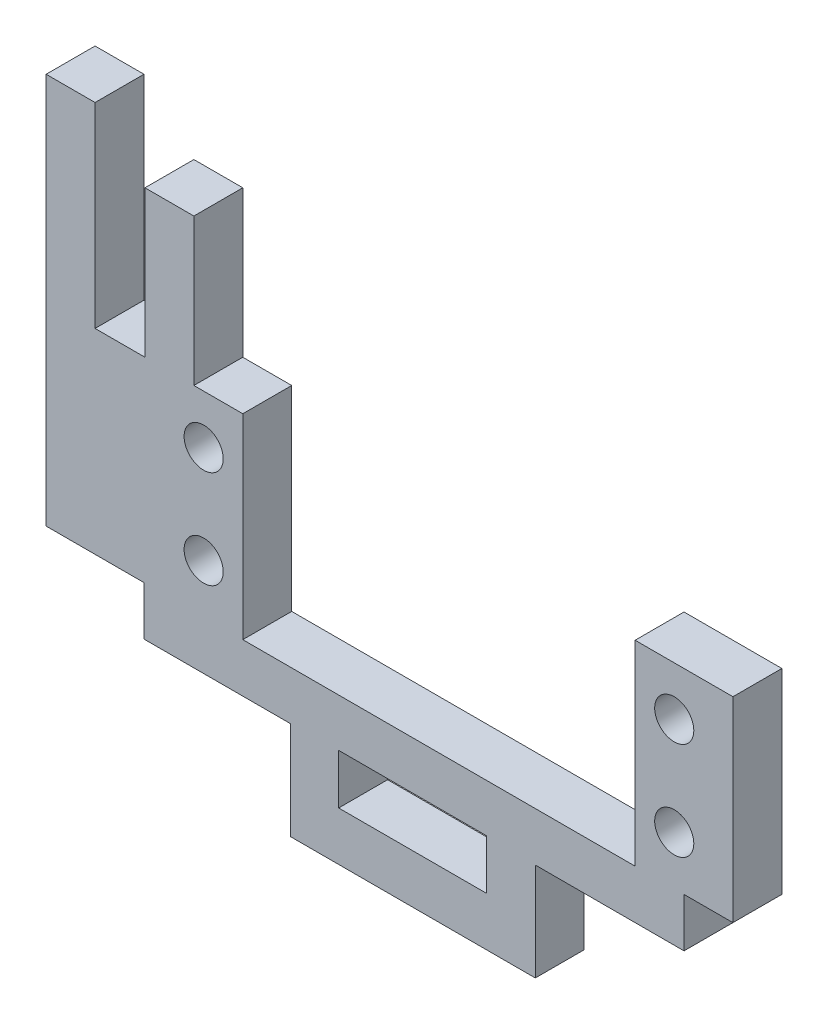
ISO-10303-21;
HEADER;
FILE_DESCRIPTION(('STEP AP214'),'2;1');
FILE_NAME('part.step','',(''),(''),'','','');
FILE_SCHEMA(('AUTOMOTIVE_DESIGN { 1 0 10303 214 1 1 1 1 }'));
ENDSEC;
DATA;
#1=APPLICATION_CONTEXT('core data for automotive mechanical design processes');
#2=APPLICATION_PROTOCOL_DEFINITION('international standard','automotive_design',2000,#1);
#3=PRODUCT_CONTEXT('',#1,'mechanical');
#4=PRODUCT('Part','Part','',(#3));
#5=PRODUCT_RELATED_PRODUCT_CATEGORY('part','',(#4));
#6=PRODUCT_DEFINITION_FORMATION('','',#4);
#7=PRODUCT_DEFINITION_CONTEXT('part definition',#1,'design');
#8=PRODUCT_DEFINITION('design','',#6,#7);
#9=PRODUCT_DEFINITION_SHAPE('','',#8);
#10=(LENGTH_UNIT() NAMED_UNIT(*) SI_UNIT(.MILLI.,.METRE.));
#11=(NAMED_UNIT(*) PLANE_ANGLE_UNIT() SI_UNIT($,.RADIAN.));
#12=(NAMED_UNIT(*) SI_UNIT($,.STERADIAN.) SOLID_ANGLE_UNIT());
#13=UNCERTAINTY_MEASURE_WITH_UNIT(LENGTH_MEASURE(1.E-05),#10,'distance_accuracy_value','');
#14=(GEOMETRIC_REPRESENTATION_CONTEXT(3) GLOBAL_UNCERTAINTY_ASSIGNED_CONTEXT((#13)) GLOBAL_UNIT_ASSIGNED_CONTEXT((#10,
#11,#12)) REPRESENTATION_CONTEXT('',''));
#15=CARTESIAN_POINT('',(0.,0.,0.));
#16=DIRECTION('',(0.,0.,1.));
#17=DIRECTION('',(1.,0.,0.));
#18=AXIS2_PLACEMENT_3D('',#15,#16,#17);
#19=CARTESIAN_POINT('',(0.,0.,5.));
#20=DIRECTION('',(0.,0.,-1.));
#21=DIRECTION('',(-1.,0.,0.));
#22=AXIS2_PLACEMENT_3D('',#19,#20,#21);
#23=PLANE('',#22);
#24=DIRECTION('',(0.,-1.,0.));
#25=VECTOR('',#24,1.);
#26=CARTESIAN_POINT('',(-70.2,-20.,5.));
#27=LINE('',#26,#25);
#28=CARTESIAN_POINT('',(-70.2,20.,5.));
#29=VERTEX_POINT('',#28);
#30=CARTESIAN_POINT('',(-70.2,-20.,5.));
#31=VERTEX_POINT('',#30);
#32=EDGE_CURVE('E257',#29,#31,#27,.T.);
#33=ORIENTED_EDGE('',*,*,#32,.T.);
#34=DIRECTION('',(1.,0.,0.));
#35=VECTOR('',#34,1.);
#36=CARTESIAN_POINT('',(-70.2,-20.,5.));
#37=LINE('',#36,#35);
#38=CARTESIAN_POINT('',(-60.2,-20.,5.));
#39=VERTEX_POINT('',#38);
#40=EDGE_CURVE('E260',#31,#39,#37,.T.);
#41=ORIENTED_EDGE('',*,*,#40,.T.);
#42=DIRECTION('',(0.,-1.,0.));
#43=VECTOR('',#42,1.);
#44=CARTESIAN_POINT('',(-60.2,-20.,5.));
#45=LINE('',#44,#43);
#46=CARTESIAN_POINT('',(-60.2,-25.,5.));
#47=VERTEX_POINT('',#46);
#48=EDGE_CURVE('E263',#39,#47,#45,.T.);
#49=ORIENTED_EDGE('',*,*,#48,.T.);
#50=DIRECTION('',(1.,0.,0.));
#51=VECTOR('',#50,1.);
#52=CARTESIAN_POINT('',(-45.2,-25.,5.));
#53=LINE('',#52,#51);
#54=CARTESIAN_POINT('',(-45.2,-25.,5.));
#55=VERTEX_POINT('',#54);
#56=EDGE_CURVE('E265',#47,#55,#53,.T.);
#57=ORIENTED_EDGE('',*,*,#56,.T.);
#58=DIRECTION('',(0.,-1.,0.));
#59=VECTOR('',#58,1.);
#60=CARTESIAN_POINT('',(-45.2,-35.,5.));
#61=LINE('',#60,#59);
#62=CARTESIAN_POINT('',(-45.2,-35.,5.));
#63=VERTEX_POINT('',#62);
#64=EDGE_CURVE('E267',#55,#63,#61,.T.);
#65=ORIENTED_EDGE('',*,*,#64,.T.);
#66=DIRECTION('',(1.,0.,0.));
#67=VECTOR('',#66,1.);
#68=CARTESIAN_POINT('',(-20.2,-35.,5.));
#69=LINE('',#68,#67);
#70=CARTESIAN_POINT('',(-20.2,-35.,5.));
#71=VERTEX_POINT('',#70);
#72=EDGE_CURVE('E269',#63,#71,#69,.T.);
#73=ORIENTED_EDGE('',*,*,#72,.T.);
#74=DIRECTION('',(0.,1.,0.));
#75=VECTOR('',#74,1.);
#76=CARTESIAN_POINT('',(-20.2,-25.,5.));
#77=LINE('',#76,#75);
#78=CARTESIAN_POINT('',(-20.2,-25.,5.));
#79=VERTEX_POINT('',#78);
#80=EDGE_CURVE('E271',#71,#79,#77,.T.);
#81=ORIENTED_EDGE('',*,*,#80,.T.);
#82=DIRECTION('',(1.,0.,0.));
#83=VECTOR('',#82,1.);
#84=CARTESIAN_POINT('',(-5.,-25.,5.));
#85=LINE('',#84,#83);
#86=CARTESIAN_POINT('',(-5.,-25.,5.));
#87=VERTEX_POINT('',#86);
#88=EDGE_CURVE('E273',#79,#87,#85,.T.);
#89=ORIENTED_EDGE('',*,*,#88,.T.);
#90=DIRECTION('',(0.,1.,0.));
#91=VECTOR('',#90,1.);
#92=CARTESIAN_POINT('',(-5.,-20.,5.));
#93=LINE('',#92,#91);
#94=CARTESIAN_POINT('',(-5.,-20.,5.));
#95=VERTEX_POINT('',#94);
#96=EDGE_CURVE('E275',#87,#95,#93,.T.);
#97=ORIENTED_EDGE('',*,*,#96,.T.);
#98=DIRECTION('',(1.,0.,0.));
#99=VECTOR('',#98,1.);
#100=CARTESIAN_POINT('',(0.,-20.,5.));
#101=LINE('',#100,#99);
#102=CARTESIAN_POINT('',(0.,-20.,5.));
#103=VERTEX_POINT('',#102);
#104=EDGE_CURVE('E277',#95,#103,#101,.T.);
#105=ORIENTED_EDGE('',*,*,#104,.T.);
#106=DIRECTION('',(0.,1.,0.));
#107=VECTOR('',#106,1.);
#108=CARTESIAN_POINT('',(0.,0.,5.));
#109=LINE('',#108,#107);
#110=CARTESIAN_POINT('',(0.,0.,5.));
#111=VERTEX_POINT('',#110);
#112=EDGE_CURVE('E279',#103,#111,#109,.T.);
#113=ORIENTED_EDGE('',*,*,#112,.T.);
#114=DIRECTION('',(-1.,0.,0.));
#115=VECTOR('',#114,1.);
#116=CARTESIAN_POINT('',(-10.,0.,5.));
#117=LINE('',#116,#115);
#118=CARTESIAN_POINT('',(-10.,0.,5.));
#119=VERTEX_POINT('',#118);
#120=EDGE_CURVE('E281',#111,#119,#117,.T.);
#121=ORIENTED_EDGE('',*,*,#120,.T.);
#122=DIRECTION('',(0.,-1.,0.));
#123=VECTOR('',#122,1.);
#124=CARTESIAN_POINT('',(-10.,-20.,5.));
#125=LINE('',#124,#123);
#126=CARTESIAN_POINT('',(-10.,-20.,5.));
#127=VERTEX_POINT('',#126);
#128=EDGE_CURVE('E283',#119,#127,#125,.T.);
#129=ORIENTED_EDGE('',*,*,#128,.T.);
#130=DIRECTION('',(-1.,0.,0.));
#131=VECTOR('',#130,1.);
#132=CARTESIAN_POINT('',(-50.1,-20.,5.));
#133=LINE('',#132,#131);
#134=CARTESIAN_POINT('',(-50.1,-20.,5.));
#135=VERTEX_POINT('',#134);
#136=EDGE_CURVE('E285',#127,#135,#133,.T.);
#137=ORIENTED_EDGE('',*,*,#136,.T.);
#138=DIRECTION('',(0.,1.,0.));
#139=VECTOR('',#138,1.);
#140=CARTESIAN_POINT('',(-50.1,0.,5.));
#141=LINE('',#140,#139);
#142=CARTESIAN_POINT('',(-50.1,0.,5.));
#143=VERTEX_POINT('',#142);
#144=EDGE_CURVE('E287',#135,#143,#141,.T.);
#145=ORIENTED_EDGE('',*,*,#144,.T.);
#146=DIRECTION('',(-1.,0.,0.));
#147=VECTOR('',#146,1.);
#148=CARTESIAN_POINT('',(-55.1,0.,5.));
#149=LINE('',#148,#147);
#150=CARTESIAN_POINT('',(-55.1,0.,5.));
#151=VERTEX_POINT('',#150);
#152=EDGE_CURVE('E289',#143,#151,#149,.T.);
#153=ORIENTED_EDGE('',*,*,#152,.T.);
#154=DIRECTION('',(0.,1.,0.));
#155=VECTOR('',#154,1.);
#156=CARTESIAN_POINT('',(-55.1,15.,5.));
#157=LINE('',#156,#155);
#158=CARTESIAN_POINT('',(-55.1,15.,5.));
#159=VERTEX_POINT('',#158);
#160=EDGE_CURVE('E291',#151,#159,#157,.T.);
#161=ORIENTED_EDGE('',*,*,#160,.T.);
#162=DIRECTION('',(-1.,0.,0.));
#163=VECTOR('',#162,1.);
#164=CARTESIAN_POINT('',(-60.1,15.,5.));
#165=LINE('',#164,#163);
#166=CARTESIAN_POINT('',(-60.1,15.,5.));
#167=VERTEX_POINT('',#166);
#168=EDGE_CURVE('E293',#159,#167,#165,.T.);
#169=ORIENTED_EDGE('',*,*,#168,.T.);
#170=DIRECTION('',(0.,-1.,0.));
#171=VECTOR('',#170,1.);
#172=CARTESIAN_POINT('',(-60.1,0.,5.));
#173=LINE('',#172,#171);
#174=CARTESIAN_POINT('',(-60.1,0.,5.));
#175=VERTEX_POINT('',#174);
#176=EDGE_CURVE('E295',#167,#175,#173,.T.);
#177=ORIENTED_EDGE('',*,*,#176,.T.);
#178=DIRECTION('',(-1.,0.,0.));
#179=VECTOR('',#178,1.);
#180=CARTESIAN_POINT('',(-65.2,0.,5.));
#181=LINE('',#180,#179);
#182=CARTESIAN_POINT('',(-65.2,0.,5.));
#183=VERTEX_POINT('',#182);
#184=EDGE_CURVE('E297',#175,#183,#181,.T.);
#185=ORIENTED_EDGE('',*,*,#184,.T.);
#186=DIRECTION('',(0.,1.,0.));
#187=VECTOR('',#186,1.);
#188=CARTESIAN_POINT('',(-65.2,20.,5.));
#189=LINE('',#188,#187);
#190=CARTESIAN_POINT('',(-65.2,20.,5.));
#191=VERTEX_POINT('',#190);
#192=EDGE_CURVE('E299',#183,#191,#189,.T.);
#193=ORIENTED_EDGE('',*,*,#192,.T.);
#194=DIRECTION('',(-1.,0.,0.));
#195=VECTOR('',#194,1.);
#196=CARTESIAN_POINT('',(-70.2,20.,5.));
#197=LINE('',#196,#195);
#198=EDGE_CURVE('E301',#191,#29,#197,.T.);
#199=ORIENTED_EDGE('',*,*,#198,.T.);
#200=EDGE_LOOP('',(#33,#41,#49,#57,#65,#73,#81,#89,#97,#105,#113,#121,#129,#137,#145,#153,#161,
#169,#177,#185,#193,#199));
#201=FACE_BOUND('',#200,.T.);
#202=DIRECTION('',(0.,1.,0.));
#203=VECTOR('',#202,1.);
#204=CARTESIAN_POINT('',(-25.2,-24.9,5.));
#205=LINE('',#204,#203);
#206=CARTESIAN_POINT('',(-25.2,-30.,5.));
#207=VERTEX_POINT('',#206);
#208=CARTESIAN_POINT('',(-25.2,-24.9,5.));
#209=VERTEX_POINT('',#208);
#210=EDGE_CURVE('E218',#207,#209,#205,.T.);
#211=ORIENTED_EDGE('',*,*,#210,.F.);
#212=DIRECTION('',(1.,0.,0.));
#213=VECTOR('',#212,1.);
#214=CARTESIAN_POINT('',(-40.3,-30.,5.));
#215=LINE('',#214,#213);
#216=CARTESIAN_POINT('',(-40.3,-30.,5.));
#217=VERTEX_POINT('',#216);
#218=EDGE_CURVE('E241',#217,#207,#215,.T.);
#219=ORIENTED_EDGE('',*,*,#218,.F.);
#220=DIRECTION('',(0.,-1.,0.));
#221=VECTOR('',#220,1.);
#222=CARTESIAN_POINT('',(-40.3,-24.9,5.));
#223=LINE('',#222,#221);
#224=CARTESIAN_POINT('',(-40.3,-24.9,5.));
#225=VERTEX_POINT('',#224);
#226=EDGE_CURVE('E239',#225,#217,#223,.T.);
#227=ORIENTED_EDGE('',*,*,#226,.F.);
#228=DIRECTION('',(-1.,0.,0.));
#229=VECTOR('',#228,1.);
#230=CARTESIAN_POINT('',(-40.3,-24.9,5.));
#231=LINE('',#230,#229);
#232=EDGE_CURVE('E226',#209,#225,#231,.T.);
#233=ORIENTED_EDGE('',*,*,#232,.F.);
#234=EDGE_LOOP('',(#211,#219,#227,#233));
#235=FACE_BOUND('',#234,.T.);
#236=CARTESIAN_POINT('',(-54.1,-5.00000000000001,5.));
#237=DIRECTION('',(0.,0.,1.));
#238=DIRECTION('',(1.,0.,0.));
#239=AXIS2_PLACEMENT_3D('',#236,#237,#238);
#240=CIRCLE('',#239,2.);
#241=CARTESIAN_POINT('',(-52.1,-5.00000000000001,5.));
#242=VERTEX_POINT('',#241);
#243=EDGE_CURVE('E247',#242,#242,#240,.T.);
#244=ORIENTED_EDGE('',*,*,#243,.F.);
#245=EDGE_LOOP('',(#244));
#246=FACE_BOUND('',#245,.T.);
#247=CARTESIAN_POINT('',(-54.1,-15.,5.));
#248=DIRECTION('',(0.,0.,1.));
#249=DIRECTION('',(1.,0.,0.));
#250=AXIS2_PLACEMENT_3D('',#247,#248,#249);
#251=CIRCLE('',#250,2.);
#252=CARTESIAN_POINT('',(-52.1,-15.,5.));
#253=VERTEX_POINT('',#252);
#254=EDGE_CURVE('E801',#253,#253,#251,.T.);
#255=ORIENTED_EDGE('',*,*,#254,.F.);
#256=EDGE_LOOP('',(#255));
#257=FACE_BOUND('',#256,.T.);
#258=CARTESIAN_POINT('',(-6.,-5.00000000000001,5.));
#259=DIRECTION('',(0.,0.,1.));
#260=DIRECTION('',(1.,0.,0.));
#261=AXIS2_PLACEMENT_3D('',#258,#259,#260);
#262=CIRCLE('',#261,2.);
#263=CARTESIAN_POINT('',(-4.,-5.00000000000001,5.));
#264=VERTEX_POINT('',#263);
#265=EDGE_CURVE('E795',#264,#264,#262,.T.);
#266=ORIENTED_EDGE('',*,*,#265,.F.);
#267=EDGE_LOOP('',(#266));
#268=FACE_BOUND('',#267,.T.);
#269=CARTESIAN_POINT('',(-6.,-15.,5.));
#270=DIRECTION('',(0.,0.,1.));
#271=DIRECTION('',(1.,0.,0.));
#272=AXIS2_PLACEMENT_3D('',#269,#270,#271);
#273=CIRCLE('',#272,2.);
#274=CARTESIAN_POINT('',(-4.,-15.,5.));
#275=VERTEX_POINT('',#274);
#276=EDGE_CURVE('E786',#275,#275,#273,.T.);
#277=ORIENTED_EDGE('',*,*,#276,.F.);
#278=EDGE_LOOP('',(#277));
#279=FACE_BOUND('',#278,.T.);
#280=ADVANCED_FACE('F45',(#201,#235,#246,#257,#268,#279),#23,.F.);
#281=CARTESIAN_POINT('',(0.,0.,0.));
#282=DIRECTION('',(0.,0.,-1.));
#283=DIRECTION('',(-1.,0.,0.));
#284=AXIS2_PLACEMENT_3D('',#281,#282,#283);
#285=PLANE('',#284);
#286=CARTESIAN_POINT('',(-6.,-5.00000000000001,0.));
#287=DIRECTION('',(0.,0.,1.));
#288=DIRECTION('',(1.,0.,0.));
#289=AXIS2_PLACEMENT_3D('',#286,#287,#288);
#290=CIRCLE('',#289,2.);
#291=CARTESIAN_POINT('',(-4.,-5.00000000000001,0.));
#292=VERTEX_POINT('',#291);
#293=EDGE_CURVE('E792',#292,#292,#290,.T.);
#294=ORIENTED_EDGE('',*,*,#293,.T.);
#295=EDGE_LOOP('',(#294));
#296=FACE_BOUND('',#295,.T.);
#297=CARTESIAN_POINT('',(-54.1,-5.00000000000001,0.));
#298=DIRECTION('',(0.,0.,1.));
#299=DIRECTION('',(1.,0.,0.));
#300=AXIS2_PLACEMENT_3D('',#297,#298,#299);
#301=CIRCLE('',#300,2.);
#302=CARTESIAN_POINT('',(-52.1,-5.00000000000001,0.));
#303=VERTEX_POINT('',#302);
#304=EDGE_CURVE('E804',#303,#303,#301,.T.);
#305=ORIENTED_EDGE('',*,*,#304,.T.);
#306=EDGE_LOOP('',(#305));
#307=FACE_BOUND('',#306,.T.);
#308=DIRECTION('',(0.,-1.,0.));
#309=VECTOR('',#308,1.);
#310=CARTESIAN_POINT('',(-70.2,-20.,0.));
#311=LINE('',#310,#309);
#312=CARTESIAN_POINT('',(-70.2,20.,0.));
#313=VERTEX_POINT('',#312);
#314=CARTESIAN_POINT('',(-70.2,-20.,0.));
#315=VERTEX_POINT('',#314);
#316=EDGE_CURVE('E234',#313,#315,#311,.T.);
#317=ORIENTED_EDGE('',*,*,#316,.F.);
#318=DIRECTION('',(-1.,0.,0.));
#319=VECTOR('',#318,1.);
#320=CARTESIAN_POINT('',(-70.2,20.,0.));
#321=LINE('',#320,#319);
#322=CARTESIAN_POINT('',(-65.2,20.,0.));
#323=VERTEX_POINT('',#322);
#324=EDGE_CURVE('E261',#323,#313,#321,.T.);
#325=ORIENTED_EDGE('',*,*,#324,.F.);
#326=DIRECTION('',(0.,1.,0.));
#327=VECTOR('',#326,1.);
#328=CARTESIAN_POINT('',(-65.2,20.,0.));
#329=LINE('',#328,#327);
#330=CARTESIAN_POINT('',(-65.2,0.,0.));
#331=VERTEX_POINT('',#330);
#332=EDGE_CURVE('E344',#331,#323,#329,.T.);
#333=ORIENTED_EDGE('',*,*,#332,.F.);
#334=DIRECTION('',(-1.,0.,0.));
#335=VECTOR('',#334,1.);
#336=CARTESIAN_POINT('',(-65.2,0.,0.));
#337=LINE('',#336,#335);
#338=CARTESIAN_POINT('',(-60.1,0.,0.));
#339=VERTEX_POINT('',#338);
#340=EDGE_CURVE('E342',#339,#331,#337,.T.);
#341=ORIENTED_EDGE('',*,*,#340,.F.);
#342=DIRECTION('',(0.,-1.,0.));
#343=VECTOR('',#342,1.);
#344=CARTESIAN_POINT('',(-60.1,0.,0.));
#345=LINE('',#344,#343);
#346=CARTESIAN_POINT('',(-60.1,15.,0.));
#347=VERTEX_POINT('',#346);
#348=EDGE_CURVE('E340',#347,#339,#345,.T.);
#349=ORIENTED_EDGE('',*,*,#348,.F.);
#350=DIRECTION('',(-1.,0.,0.));
#351=VECTOR('',#350,1.);
#352=CARTESIAN_POINT('',(-60.1,15.,0.));
#353=LINE('',#352,#351);
#354=CARTESIAN_POINT('',(-55.1,15.,0.));
#355=VERTEX_POINT('',#354);
#356=EDGE_CURVE('E338',#355,#347,#353,.T.);
#357=ORIENTED_EDGE('',*,*,#356,.F.);
#358=DIRECTION('',(0.,1.,0.));
#359=VECTOR('',#358,1.);
#360=CARTESIAN_POINT('',(-55.1,15.,0.));
#361=LINE('',#360,#359);
#362=CARTESIAN_POINT('',(-55.1,0.,0.));
#363=VERTEX_POINT('',#362);
#364=EDGE_CURVE('E336',#363,#355,#361,.T.);
#365=ORIENTED_EDGE('',*,*,#364,.F.);
#366=DIRECTION('',(-1.,0.,0.));
#367=VECTOR('',#366,1.);
#368=CARTESIAN_POINT('',(-55.1,0.,0.));
#369=LINE('',#368,#367);
#370=CARTESIAN_POINT('',(-50.1,0.,0.));
#371=VERTEX_POINT('',#370);
#372=EDGE_CURVE('E334',#371,#363,#369,.T.);
#373=ORIENTED_EDGE('',*,*,#372,.F.);
#374=DIRECTION('',(0.,1.,0.));
#375=VECTOR('',#374,1.);
#376=CARTESIAN_POINT('',(-50.1,0.,0.));
#377=LINE('',#376,#375);
#378=CARTESIAN_POINT('',(-50.1,-20.,0.));
#379=VERTEX_POINT('',#378);
#380=EDGE_CURVE('E332',#379,#371,#377,.T.);
#381=ORIENTED_EDGE('',*,*,#380,.F.);
#382=DIRECTION('',(-1.,0.,0.));
#383=VECTOR('',#382,1.);
#384=CARTESIAN_POINT('',(-50.1,-20.,0.));
#385=LINE('',#384,#383);
#386=CARTESIAN_POINT('',(-10.,-20.,0.));
#387=VERTEX_POINT('',#386);
#388=EDGE_CURVE('E330',#387,#379,#385,.T.);
#389=ORIENTED_EDGE('',*,*,#388,.F.);
#390=DIRECTION('',(0.,-1.,0.));
#391=VECTOR('',#390,1.);
#392=CARTESIAN_POINT('',(-10.,-20.,0.));
#393=LINE('',#392,#391);
#394=CARTESIAN_POINT('',(-10.,0.,0.));
#395=VERTEX_POINT('',#394);
#396=EDGE_CURVE('E328',#395,#387,#393,.T.);
#397=ORIENTED_EDGE('',*,*,#396,.F.);
#398=DIRECTION('',(-1.,0.,0.));
#399=VECTOR('',#398,1.);
#400=CARTESIAN_POINT('',(-10.,0.,0.));
#401=LINE('',#400,#399);
#402=CARTESIAN_POINT('',(0.,0.,0.));
#403=VERTEX_POINT('',#402);
#404=EDGE_CURVE('E326',#403,#395,#401,.T.);
#405=ORIENTED_EDGE('',*,*,#404,.F.);
#406=DIRECTION('',(0.,1.,0.));
#407=VECTOR('',#406,1.);
#408=CARTESIAN_POINT('',(0.,0.,0.));
#409=LINE('',#408,#407);
#410=CARTESIAN_POINT('',(0.,-20.,0.));
#411=VERTEX_POINT('',#410);
#412=EDGE_CURVE('E324',#411,#403,#409,.T.);
#413=ORIENTED_EDGE('',*,*,#412,.F.);
#414=DIRECTION('',(1.,0.,0.));
#415=VECTOR('',#414,1.);
#416=CARTESIAN_POINT('',(0.,-20.,0.));
#417=LINE('',#416,#415);
#418=CARTESIAN_POINT('',(-5.,-20.,0.));
#419=VERTEX_POINT('',#418);
#420=EDGE_CURVE('E322',#419,#411,#417,.T.);
#421=ORIENTED_EDGE('',*,*,#420,.F.);
#422=DIRECTION('',(0.,1.,0.));
#423=VECTOR('',#422,1.);
#424=CARTESIAN_POINT('',(-5.,-20.,0.));
#425=LINE('',#424,#423);
#426=CARTESIAN_POINT('',(-5.,-25.,0.));
#427=VERTEX_POINT('',#426);
#428=EDGE_CURVE('E320',#427,#419,#425,.T.);
#429=ORIENTED_EDGE('',*,*,#428,.F.);
#430=DIRECTION('',(1.,0.,0.));
#431=VECTOR('',#430,1.);
#432=CARTESIAN_POINT('',(-5.,-25.,0.));
#433=LINE('',#432,#431);
#434=CARTESIAN_POINT('',(-20.2,-25.,0.));
#435=VERTEX_POINT('',#434);
#436=EDGE_CURVE('E318',#435,#427,#433,.T.);
#437=ORIENTED_EDGE('',*,*,#436,.F.);
#438=DIRECTION('',(0.,1.,0.));
#439=VECTOR('',#438,1.);
#440=CARTESIAN_POINT('',(-20.2,-25.,0.));
#441=LINE('',#440,#439);
#442=CARTESIAN_POINT('',(-20.2,-35.,0.));
#443=VERTEX_POINT('',#442);
#444=EDGE_CURVE('E316',#443,#435,#441,.T.);
#445=ORIENTED_EDGE('',*,*,#444,.F.);
#446=DIRECTION('',(1.,0.,0.));
#447=VECTOR('',#446,1.);
#448=CARTESIAN_POINT('',(-20.2,-35.,0.));
#449=LINE('',#448,#447);
#450=CARTESIAN_POINT('',(-45.2,-35.,0.));
#451=VERTEX_POINT('',#450);
#452=EDGE_CURVE('E314',#451,#443,#449,.T.);
#453=ORIENTED_EDGE('',*,*,#452,.F.);
#454=DIRECTION('',(0.,-1.,0.));
#455=VECTOR('',#454,1.);
#456=CARTESIAN_POINT('',(-45.2,-35.,0.));
#457=LINE('',#456,#455);
#458=CARTESIAN_POINT('',(-45.2,-25.,0.));
#459=VERTEX_POINT('',#458);
#460=EDGE_CURVE('E312',#459,#451,#457,.T.);
#461=ORIENTED_EDGE('',*,*,#460,.F.);
#462=DIRECTION('',(1.,0.,0.));
#463=VECTOR('',#462,1.);
#464=CARTESIAN_POINT('',(-45.2,-25.,0.));
#465=LINE('',#464,#463);
#466=CARTESIAN_POINT('',(-60.2,-25.,0.));
#467=VERTEX_POINT('',#466);
#468=EDGE_CURVE('E310',#467,#459,#465,.T.);
#469=ORIENTED_EDGE('',*,*,#468,.F.);
#470=DIRECTION('',(0.,-1.,0.));
#471=VECTOR('',#470,1.);
#472=CARTESIAN_POINT('',(-60.2,-20.,0.));
#473=LINE('',#472,#471);
#474=CARTESIAN_POINT('',(-60.2,-20.,0.));
#475=VERTEX_POINT('',#474);
#476=EDGE_CURVE('E308',#475,#467,#473,.T.);
#477=ORIENTED_EDGE('',*,*,#476,.F.);
#478=DIRECTION('',(1.,0.,0.));
#479=VECTOR('',#478,1.);
#480=CARTESIAN_POINT('',(-70.2,-20.,0.));
#481=LINE('',#480,#479);
#482=EDGE_CURVE('E306',#315,#475,#481,.T.);
#483=ORIENTED_EDGE('',*,*,#482,.F.);
#484=EDGE_LOOP('',(#317,#325,#333,#341,#349,#357,#365,#373,#381,#389,#397,#405,#413,#421,#429,
#437,#445,#453,#461,#469,#477,#483));
#485=FACE_BOUND('',#484,.T.);
#486=DIRECTION('',(1.,0.,0.));
#487=VECTOR('',#486,1.);
#488=CARTESIAN_POINT('',(-40.3,-30.,0.));
#489=LINE('',#488,#487);
#490=CARTESIAN_POINT('',(-40.3,-30.,0.));
#491=VERTEX_POINT('',#490);
#492=CARTESIAN_POINT('',(-25.2,-30.,0.));
#493=VERTEX_POINT('',#492);
#494=EDGE_CURVE('E227',#491,#493,#489,.T.);
#495=ORIENTED_EDGE('',*,*,#494,.T.);
#496=DIRECTION('',(0.,1.,0.));
#497=VECTOR('',#496,1.);
#498=CARTESIAN_POINT('',(-25.2,-24.9,0.));
#499=LINE('',#498,#497);
#500=CARTESIAN_POINT('',(-25.2,-24.9,0.));
#501=VERTEX_POINT('',#500);
#502=EDGE_CURVE('E68',#493,#501,#499,.T.);
#503=ORIENTED_EDGE('',*,*,#502,.T.);
#504=DIRECTION('',(-1.,0.,0.));
#505=VECTOR('',#504,1.);
#506=CARTESIAN_POINT('',(-40.3,-24.9,0.));
#507=LINE('',#506,#505);
#508=CARTESIAN_POINT('',(-40.3,-24.9,0.));
#509=VERTEX_POINT('',#508);
#510=EDGE_CURVE('E233',#501,#509,#507,.T.);
#511=ORIENTED_EDGE('',*,*,#510,.T.);
#512=DIRECTION('',(0.,-1.,0.));
#513=VECTOR('',#512,1.);
#514=CARTESIAN_POINT('',(-40.3,-24.9,0.));
#515=LINE('',#514,#513);
#516=EDGE_CURVE('E249',#509,#491,#515,.T.);
#517=ORIENTED_EDGE('',*,*,#516,.T.);
#518=EDGE_LOOP('',(#495,#503,#511,#517));
#519=FACE_BOUND('',#518,.T.);
#520=CARTESIAN_POINT('',(-54.1,-15.,0.));
#521=DIRECTION('',(0.,0.,1.));
#522=DIRECTION('',(1.,0.,0.));
#523=AXIS2_PLACEMENT_3D('',#520,#521,#522);
#524=CIRCLE('',#523,2.);
#525=CARTESIAN_POINT('',(-52.1,-15.,0.));
#526=VERTEX_POINT('',#525);
#527=EDGE_CURVE('E798',#526,#526,#524,.T.);
#528=ORIENTED_EDGE('',*,*,#527,.T.);
#529=EDGE_LOOP('',(#528));
#530=FACE_BOUND('',#529,.T.);
#531=CARTESIAN_POINT('',(-6.,-15.,0.));
#532=DIRECTION('',(0.,0.,1.));
#533=DIRECTION('',(1.,0.,0.));
#534=AXIS2_PLACEMENT_3D('',#531,#532,#533);
#535=CIRCLE('',#534,2.);
#536=CARTESIAN_POINT('',(-4.,-15.,0.));
#537=VERTEX_POINT('',#536);
#538=EDGE_CURVE('E789',#537,#537,#535,.T.);
#539=ORIENTED_EDGE('',*,*,#538,.T.);
#540=EDGE_LOOP('',(#539));
#541=FACE_BOUND('',#540,.T.);
#542=ADVANCED_FACE('F416',(#296,#307,#485,#519,#530,#541),#285,.T.);
#543=CARTESIAN_POINT('',(-70.2,-20.,5.));
#544=DIRECTION('',(1.,0.,0.));
#545=DIRECTION('',(0.,1.,0.));
#546=AXIS2_PLACEMENT_3D('',#543,#544,#545);
#547=PLANE('',#546);
#548=ORIENTED_EDGE('',*,*,#316,.T.);
#549=DIRECTION('',(0.,0.,-1.));
#550=VECTOR('',#549,1.);
#551=CARTESIAN_POINT('',(-70.2,-20.,5.));
#552=LINE('',#551,#550);
#553=EDGE_CURVE('E13',#31,#315,#552,.T.);
#554=ORIENTED_EDGE('',*,*,#553,.F.);
#555=ORIENTED_EDGE('',*,*,#32,.F.);
#556=DIRECTION('',(0.,0.,-1.));
#557=VECTOR('',#556,1.);
#558=CARTESIAN_POINT('',(-70.2,20.,5.));
#559=LINE('',#558,#557);
#560=EDGE_CURVE('E303',#29,#313,#559,.T.);
#561=ORIENTED_EDGE('',*,*,#560,.T.);
#562=EDGE_LOOP('',(#548,#554,#555,#561));
#563=FACE_BOUND('',#562,.T.);
#564=ADVANCED_FACE('F47',(#563),#547,.F.);
#565=CARTESIAN_POINT('',(-70.2,-20.,5.));
#566=DIRECTION('',(0.,1.,0.));
#567=DIRECTION('',(-1.,0.,0.));
#568=AXIS2_PLACEMENT_3D('',#565,#566,#567);
#569=PLANE('',#568);
#570=ORIENTED_EDGE('',*,*,#482,.T.);
#571=DIRECTION('',(0.,0.,-1.));
#572=VECTOR('',#571,1.);
#573=CARTESIAN_POINT('',(-60.2,-20.,5.));
#574=LINE('',#573,#572);
#575=EDGE_CURVE('E53',#39,#475,#574,.T.);
#576=ORIENTED_EDGE('',*,*,#575,.F.);
#577=ORIENTED_EDGE('',*,*,#40,.F.);
#578=ORIENTED_EDGE('',*,*,#553,.T.);
#579=EDGE_LOOP('',(#570,#576,#577,#578));
#580=FACE_BOUND('',#579,.T.);
#581=ADVANCED_FACE('F433',(#580),#569,.F.);
#582=CARTESIAN_POINT('',(-60.2,-20.,5.));
#583=DIRECTION('',(1.,0.,0.));
#584=DIRECTION('',(0.,0.,-1.));
#585=AXIS2_PLACEMENT_3D('',#582,#583,#584);
#586=PLANE('',#585);
#587=ORIENTED_EDGE('',*,*,#476,.T.);
#588=DIRECTION('',(0.,0.,-1.));
#589=VECTOR('',#588,1.);
#590=CARTESIAN_POINT('',(-60.2,-25.,5.));
#591=LINE('',#590,#589);
#592=EDGE_CURVE('E403',#47,#467,#591,.T.);
#593=ORIENTED_EDGE('',*,*,#592,.F.);
#594=ORIENTED_EDGE('',*,*,#48,.F.);
#595=ORIENTED_EDGE('',*,*,#575,.T.);
#596=EDGE_LOOP('',(#587,#593,#594,#595));
#597=FACE_BOUND('',#596,.T.);
#598=ADVANCED_FACE('F410',(#597),#586,.F.);
#599=CARTESIAN_POINT('',(-45.2,-25.,5.));
#600=DIRECTION('',(0.,1.,0.));
#601=DIRECTION('',(-1.,0.,0.));
#602=AXIS2_PLACEMENT_3D('',#599,#600,#601);
#603=PLANE('',#602);
#604=ORIENTED_EDGE('',*,*,#468,.T.);
#605=DIRECTION('',(0.,0.,-1.));
#606=VECTOR('',#605,1.);
#607=CARTESIAN_POINT('',(-45.2,-25.,5.));
#608=LINE('',#607,#606);
#609=EDGE_CURVE('E400',#55,#459,#608,.T.);
#610=ORIENTED_EDGE('',*,*,#609,.F.);
#611=ORIENTED_EDGE('',*,*,#56,.F.);
#612=ORIENTED_EDGE('',*,*,#592,.T.);
#613=EDGE_LOOP('',(#604,#610,#611,#612));
#614=FACE_BOUND('',#613,.T.);
#615=ADVANCED_FACE('F422',(#614),#603,.F.);
#616=CARTESIAN_POINT('',(-45.2,-35.,5.));
#617=DIRECTION('',(1.,0.,0.));
#618=DIRECTION('',(0.,0.,-1.));
#619=AXIS2_PLACEMENT_3D('',#616,#617,#618);
#620=PLANE('',#619);
#621=ORIENTED_EDGE('',*,*,#460,.T.);
#622=DIRECTION('',(0.,0.,-1.));
#623=VECTOR('',#622,1.);
#624=CARTESIAN_POINT('',(-45.2,-35.,5.));
#625=LINE('',#624,#623);
#626=EDGE_CURVE('E397',#63,#451,#625,.T.);
#627=ORIENTED_EDGE('',*,*,#626,.F.);
#628=ORIENTED_EDGE('',*,*,#64,.F.);
#629=ORIENTED_EDGE('',*,*,#609,.T.);
#630=EDGE_LOOP('',(#621,#627,#628,#629));
#631=FACE_BOUND('',#630,.T.);
#632=ADVANCED_FACE('F426',(#631),#620,.F.);
#633=CARTESIAN_POINT('',(-20.2,-35.,5.));
#634=DIRECTION('',(0.,1.,0.));
#635=DIRECTION('',(0.,0.,1.));
#636=AXIS2_PLACEMENT_3D('',#633,#634,#635);
#637=PLANE('',#636);
#638=ORIENTED_EDGE('',*,*,#452,.T.);
#639=DIRECTION('',(0.,0.,-1.));
#640=VECTOR('',#639,1.);
#641=CARTESIAN_POINT('',(-20.2,-35.,5.));
#642=LINE('',#641,#640);
#643=EDGE_CURVE('E394',#71,#443,#642,.T.);
#644=ORIENTED_EDGE('',*,*,#643,.F.);
#645=ORIENTED_EDGE('',*,*,#72,.F.);
#646=ORIENTED_EDGE('',*,*,#626,.T.);
#647=EDGE_LOOP('',(#638,#644,#645,#646));
#648=FACE_BOUND('',#647,.T.);
#649=ADVANCED_FACE('F516',(#648),#637,.F.);
#650=CARTESIAN_POINT('',(-20.2,-25.,5.));
#651=DIRECTION('',(-1.,0.,0.));
#652=DIRECTION('',(0.,-1.,0.));
#653=AXIS2_PLACEMENT_3D('',#650,#651,#652);
#654=PLANE('',#653);
#655=ORIENTED_EDGE('',*,*,#444,.T.);
#656=DIRECTION('',(0.,0.,-1.));
#657=VECTOR('',#656,1.);
#658=CARTESIAN_POINT('',(-20.2,-25.,5.));
#659=LINE('',#658,#657);
#660=EDGE_CURVE('E391',#79,#435,#659,.T.);
#661=ORIENTED_EDGE('',*,*,#660,.F.);
#662=ORIENTED_EDGE('',*,*,#80,.F.);
#663=ORIENTED_EDGE('',*,*,#643,.T.);
#664=EDGE_LOOP('',(#655,#661,#662,#663));
#665=FACE_BOUND('',#664,.T.);
#666=ADVANCED_FACE('F513',(#665),#654,.F.);
#667=CARTESIAN_POINT('',(-5.,-25.,5.));
#668=DIRECTION('',(0.,1.,0.));
#669=DIRECTION('',(-1.,0.,0.));
#670=AXIS2_PLACEMENT_3D('',#667,#668,#669);
#671=PLANE('',#670);
#672=ORIENTED_EDGE('',*,*,#436,.T.);
#673=DIRECTION('',(0.,0.,-1.));
#674=VECTOR('',#673,1.);
#675=CARTESIAN_POINT('',(-5.,-25.,5.));
#676=LINE('',#675,#674);
#677=EDGE_CURVE('E388',#87,#427,#676,.T.);
#678=ORIENTED_EDGE('',*,*,#677,.F.);
#679=ORIENTED_EDGE('',*,*,#88,.F.);
#680=ORIENTED_EDGE('',*,*,#660,.T.);
#681=EDGE_LOOP('',(#672,#678,#679,#680));
#682=FACE_BOUND('',#681,.T.);
#683=ADVANCED_FACE('F509',(#682),#671,.F.);
#684=CARTESIAN_POINT('',(-5.,-20.,5.));
#685=DIRECTION('',(-1.,0.,0.));
#686=DIRECTION('',(0.,0.,1.));
#687=AXIS2_PLACEMENT_3D('',#684,#685,#686);
#688=PLANE('',#687);
#689=ORIENTED_EDGE('',*,*,#428,.T.);
#690=DIRECTION('',(0.,0.,-1.));
#691=VECTOR('',#690,1.);
#692=CARTESIAN_POINT('',(-5.,-20.,5.));
#693=LINE('',#692,#691);
#694=EDGE_CURVE('E385',#95,#419,#693,.T.);
#695=ORIENTED_EDGE('',*,*,#694,.F.);
#696=ORIENTED_EDGE('',*,*,#96,.F.);
#697=ORIENTED_EDGE('',*,*,#677,.T.);
#698=EDGE_LOOP('',(#689,#695,#696,#697));
#699=FACE_BOUND('',#698,.T.);
#700=ADVANCED_FACE('F505',(#699),#688,.F.);
#701=CARTESIAN_POINT('',(0.,-20.,5.));
#702=DIRECTION('',(0.,1.,0.));
#703=DIRECTION('',(-1.,0.,0.));
#704=AXIS2_PLACEMENT_3D('',#701,#702,#703);
#705=PLANE('',#704);
#706=ORIENTED_EDGE('',*,*,#420,.T.);
#707=DIRECTION('',(0.,0.,-1.));
#708=VECTOR('',#707,1.);
#709=CARTESIAN_POINT('',(0.,-20.,5.));
#710=LINE('',#709,#708);
#711=EDGE_CURVE('E382',#103,#411,#710,.T.);
#712=ORIENTED_EDGE('',*,*,#711,.F.);
#713=ORIENTED_EDGE('',*,*,#104,.F.);
#714=ORIENTED_EDGE('',*,*,#694,.T.);
#715=EDGE_LOOP('',(#706,#712,#713,#714));
#716=FACE_BOUND('',#715,.T.);
#717=ADVANCED_FACE('F500',(#716),#705,.F.);
#718=CARTESIAN_POINT('',(0.,0.,5.));
#719=DIRECTION('',(-1.,0.,0.));
#720=DIRECTION('',(0.,-1.,0.));
#721=AXIS2_PLACEMENT_3D('',#718,#719,#720);
#722=PLANE('',#721);
#723=ORIENTED_EDGE('',*,*,#412,.T.);
#724=DIRECTION('',(0.,0.,-1.));
#725=VECTOR('',#724,1.);
#726=CARTESIAN_POINT('',(0.,0.,5.));
#727=LINE('',#726,#725);
#728=EDGE_CURVE('E379',#111,#403,#727,.T.);
#729=ORIENTED_EDGE('',*,*,#728,.F.);
#730=ORIENTED_EDGE('',*,*,#112,.F.);
#731=ORIENTED_EDGE('',*,*,#711,.T.);
#732=EDGE_LOOP('',(#723,#729,#730,#731));
#733=FACE_BOUND('',#732,.T.);
#734=ADVANCED_FACE('F494',(#733),#722,.F.);
#735=CARTESIAN_POINT('',(-10.,0.,5.));
#736=DIRECTION('',(0.,-1.,0.));
#737=DIRECTION('',(0.,0.,-1.));
#738=AXIS2_PLACEMENT_3D('',#735,#736,#737);
#739=PLANE('',#738);
#740=ORIENTED_EDGE('',*,*,#404,.T.);
#741=DIRECTION('',(0.,0.,-1.));
#742=VECTOR('',#741,1.);
#743=CARTESIAN_POINT('',(-10.,0.,5.));
#744=LINE('',#743,#742);
#745=EDGE_CURVE('E376',#119,#395,#744,.T.);
#746=ORIENTED_EDGE('',*,*,#745,.F.);
#747=ORIENTED_EDGE('',*,*,#120,.F.);
#748=ORIENTED_EDGE('',*,*,#728,.T.);
#749=EDGE_LOOP('',(#740,#746,#747,#748));
#750=FACE_BOUND('',#749,.T.);
#751=ADVANCED_FACE('F490',(#750),#739,.F.);
#752=CARTESIAN_POINT('',(-10.,-20.,5.));
#753=DIRECTION('',(1.,0.,0.));
#754=DIRECTION('',(0.,0.,-1.));
#755=AXIS2_PLACEMENT_3D('',#752,#753,#754);
#756=PLANE('',#755);
#757=ORIENTED_EDGE('',*,*,#396,.T.);
#758=DIRECTION('',(0.,0.,-1.));
#759=VECTOR('',#758,1.);
#760=CARTESIAN_POINT('',(-10.,-20.,5.));
#761=LINE('',#760,#759);
#762=EDGE_CURVE('E373',#127,#387,#761,.T.);
#763=ORIENTED_EDGE('',*,*,#762,.F.);
#764=ORIENTED_EDGE('',*,*,#128,.F.);
#765=ORIENTED_EDGE('',*,*,#745,.T.);
#766=EDGE_LOOP('',(#757,#763,#764,#765));
#767=FACE_BOUND('',#766,.T.);
#768=ADVANCED_FACE('F485',(#767),#756,.F.);
#769=CARTESIAN_POINT('',(-50.1,-20.,5.));
#770=DIRECTION('',(0.,-1.,0.));
#771=DIRECTION('',(1.,0.,0.));
#772=AXIS2_PLACEMENT_3D('',#769,#770,#771);
#773=PLANE('',#772);
#774=ORIENTED_EDGE('',*,*,#388,.T.);
#775=DIRECTION('',(0.,0.,-1.));
#776=VECTOR('',#775,1.);
#777=CARTESIAN_POINT('',(-50.1,-20.,5.));
#778=LINE('',#777,#776);
#779=EDGE_CURVE('E370',#135,#379,#778,.T.);
#780=ORIENTED_EDGE('',*,*,#779,.F.);
#781=ORIENTED_EDGE('',*,*,#136,.F.);
#782=ORIENTED_EDGE('',*,*,#762,.T.);
#783=EDGE_LOOP('',(#774,#780,#781,#782));
#784=FACE_BOUND('',#783,.T.);
#785=ADVANCED_FACE('F479',(#784),#773,.F.);
#786=CARTESIAN_POINT('',(-50.1,0.,5.));
#787=DIRECTION('',(-1.,0.,0.));
#788=DIRECTION('',(0.,-1.,0.));
#789=AXIS2_PLACEMENT_3D('',#786,#787,#788);
#790=PLANE('',#789);
#791=ORIENTED_EDGE('',*,*,#380,.T.);
#792=DIRECTION('',(0.,0.,-1.));
#793=VECTOR('',#792,1.);
#794=CARTESIAN_POINT('',(-50.1,0.,5.));
#795=LINE('',#794,#793);
#796=EDGE_CURVE('E367',#143,#371,#795,.T.);
#797=ORIENTED_EDGE('',*,*,#796,.F.);
#798=ORIENTED_EDGE('',*,*,#144,.F.);
#799=ORIENTED_EDGE('',*,*,#779,.T.);
#800=EDGE_LOOP('',(#791,#797,#798,#799));
#801=FACE_BOUND('',#800,.T.);
#802=ADVANCED_FACE('F475',(#801),#790,.F.);
#803=CARTESIAN_POINT('',(-55.1,0.,5.));
#804=DIRECTION('',(0.,-1.,0.));
#805=DIRECTION('',(1.,0.,0.));
#806=AXIS2_PLACEMENT_3D('',#803,#804,#805);
#807=PLANE('',#806);
#808=ORIENTED_EDGE('',*,*,#372,.T.);
#809=DIRECTION('',(0.,0.,-1.));
#810=VECTOR('',#809,1.);
#811=CARTESIAN_POINT('',(-55.1,0.,5.));
#812=LINE('',#811,#810);
#813=EDGE_CURVE('E364',#151,#363,#812,.T.);
#814=ORIENTED_EDGE('',*,*,#813,.F.);
#815=ORIENTED_EDGE('',*,*,#152,.F.);
#816=ORIENTED_EDGE('',*,*,#796,.T.);
#817=EDGE_LOOP('',(#808,#814,#815,#816));
#818=FACE_BOUND('',#817,.T.);
#819=ADVANCED_FACE('F470',(#818),#807,.F.);
#820=CARTESIAN_POINT('',(-55.1,15.,5.));
#821=DIRECTION('',(-1.,0.,0.));
#822=DIRECTION('',(0.,0.,1.));
#823=AXIS2_PLACEMENT_3D('',#820,#821,#822);
#824=PLANE('',#823);
#825=ORIENTED_EDGE('',*,*,#364,.T.);
#826=DIRECTION('',(0.,0.,-1.));
#827=VECTOR('',#826,1.);
#828=CARTESIAN_POINT('',(-55.1,15.,5.));
#829=LINE('',#828,#827);
#830=EDGE_CURVE('E361',#159,#355,#829,.T.);
#831=ORIENTED_EDGE('',*,*,#830,.F.);
#832=ORIENTED_EDGE('',*,*,#160,.F.);
#833=ORIENTED_EDGE('',*,*,#813,.T.);
#834=EDGE_LOOP('',(#825,#831,#832,#833));
#835=FACE_BOUND('',#834,.T.);
#836=ADVANCED_FACE('F464',(#835),#824,.F.);
#837=CARTESIAN_POINT('',(-60.1,15.,5.));
#838=DIRECTION('',(0.,-1.,0.));
#839=DIRECTION('',(0.,0.,-1.));
#840=AXIS2_PLACEMENT_3D('',#837,#838,#839);
#841=PLANE('',#840);
#842=ORIENTED_EDGE('',*,*,#356,.T.);
#843=DIRECTION('',(0.,0.,-1.));
#844=VECTOR('',#843,1.);
#845=CARTESIAN_POINT('',(-60.1,15.,5.));
#846=LINE('',#845,#844);
#847=EDGE_CURVE('E358',#167,#347,#846,.T.);
#848=ORIENTED_EDGE('',*,*,#847,.F.);
#849=ORIENTED_EDGE('',*,*,#168,.F.);
#850=ORIENTED_EDGE('',*,*,#830,.T.);
#851=EDGE_LOOP('',(#842,#848,#849,#850));
#852=FACE_BOUND('',#851,.T.);
#853=ADVANCED_FACE('F460',(#852),#841,.F.);
#854=CARTESIAN_POINT('',(-60.1,0.,5.));
#855=DIRECTION('',(1.,0.,0.));
#856=DIRECTION('',(0.,0.,-1.));
#857=AXIS2_PLACEMENT_3D('',#854,#855,#856);
#858=PLANE('',#857);
#859=ORIENTED_EDGE('',*,*,#348,.T.);
#860=DIRECTION('',(0.,0.,-1.));
#861=VECTOR('',#860,1.);
#862=CARTESIAN_POINT('',(-60.1,0.,5.));
#863=LINE('',#862,#861);
#864=EDGE_CURVE('E355',#175,#339,#863,.T.);
#865=ORIENTED_EDGE('',*,*,#864,.F.);
#866=ORIENTED_EDGE('',*,*,#176,.F.);
#867=ORIENTED_EDGE('',*,*,#847,.T.);
#868=EDGE_LOOP('',(#859,#865,#866,#867));
#869=FACE_BOUND('',#868,.T.);
#870=ADVANCED_FACE('F455',(#869),#858,.F.);
#871=CARTESIAN_POINT('',(-65.2,0.,5.));
#872=DIRECTION('',(0.,-1.,0.));
#873=DIRECTION('',(0.,0.,-1.));
#874=AXIS2_PLACEMENT_3D('',#871,#872,#873);
#875=PLANE('',#874);
#876=ORIENTED_EDGE('',*,*,#340,.T.);
#877=DIRECTION('',(0.,0.,-1.));
#878=VECTOR('',#877,1.);
#879=CARTESIAN_POINT('',(-65.2,0.,5.));
#880=LINE('',#879,#878);
#881=EDGE_CURVE('E352',#183,#331,#880,.T.);
#882=ORIENTED_EDGE('',*,*,#881,.F.);
#883=ORIENTED_EDGE('',*,*,#184,.F.);
#884=ORIENTED_EDGE('',*,*,#864,.T.);
#885=EDGE_LOOP('',(#876,#882,#883,#884));
#886=FACE_BOUND('',#885,.T.);
#887=ADVANCED_FACE('F449',(#886),#875,.F.);
#888=CARTESIAN_POINT('',(-65.2,20.,5.));
#889=DIRECTION('',(-1.,0.,0.));
#890=DIRECTION('',(0.,0.,1.));
#891=AXIS2_PLACEMENT_3D('',#888,#889,#890);
#892=PLANE('',#891);
#893=ORIENTED_EDGE('',*,*,#332,.T.);
#894=DIRECTION('',(0.,0.,-1.));
#895=VECTOR('',#894,1.);
#896=CARTESIAN_POINT('',(-65.2,20.,5.));
#897=LINE('',#896,#895);
#898=EDGE_CURVE('E349',#191,#323,#897,.T.);
#899=ORIENTED_EDGE('',*,*,#898,.F.);
#900=ORIENTED_EDGE('',*,*,#192,.F.);
#901=ORIENTED_EDGE('',*,*,#881,.T.);
#902=EDGE_LOOP('',(#893,#899,#900,#901));
#903=FACE_BOUND('',#902,.T.);
#904=ADVANCED_FACE('F445',(#903),#892,.F.);
#905=CARTESIAN_POINT('',(-70.2,20.,5.));
#906=DIRECTION('',(0.,-1.,0.));
#907=DIRECTION('',(0.,0.,-1.));
#908=AXIS2_PLACEMENT_3D('',#905,#906,#907);
#909=PLANE('',#908);
#910=ORIENTED_EDGE('',*,*,#324,.T.);
#911=ORIENTED_EDGE('',*,*,#560,.F.);
#912=ORIENTED_EDGE('',*,*,#198,.F.);
#913=ORIENTED_EDGE('',*,*,#898,.T.);
#914=EDGE_LOOP('',(#910,#911,#912,#913));
#915=FACE_BOUND('',#914,.T.);
#916=ADVANCED_FACE('F440',(#915),#909,.F.);
#917=CARTESIAN_POINT('',(-25.2,-24.9,5.));
#918=DIRECTION('',(-1.,0.,0.));
#919=DIRECTION('',(0.,0.,1.));
#920=AXIS2_PLACEMENT_3D('',#917,#918,#919);
#921=PLANE('',#920);
#922=ORIENTED_EDGE('',*,*,#502,.F.);
#923=DIRECTION('',(0.,0.,-1.));
#924=VECTOR('',#923,1.);
#925=CARTESIAN_POINT('',(-25.2,-30.,5.));
#926=LINE('',#925,#924);
#927=EDGE_CURVE('E222',#207,#493,#926,.T.);
#928=ORIENTED_EDGE('',*,*,#927,.F.);
#929=ORIENTED_EDGE('',*,*,#210,.T.);
#930=DIRECTION('',(0.,0.,-1.));
#931=VECTOR('',#930,1.);
#932=CARTESIAN_POINT('',(-25.2,-24.9,5.));
#933=LINE('',#932,#931);
#934=EDGE_CURVE('E221',#209,#501,#933,.T.);
#935=ORIENTED_EDGE('',*,*,#934,.T.);
#936=EDGE_LOOP('',(#922,#928,#929,#935));
#937=FACE_BOUND('',#936,.T.);
#938=ADVANCED_FACE('F220',(#937),#921,.T.);
#939=CARTESIAN_POINT('',(-40.3,-24.9,5.));
#940=DIRECTION('',(0.,-1.,0.));
#941=DIRECTION('',(1.,0.,0.));
#942=AXIS2_PLACEMENT_3D('',#939,#940,#941);
#943=PLANE('',#942);
#944=ORIENTED_EDGE('',*,*,#510,.F.);
#945=ORIENTED_EDGE('',*,*,#934,.F.);
#946=ORIENTED_EDGE('',*,*,#232,.T.);
#947=DIRECTION('',(0.,0.,-1.));
#948=VECTOR('',#947,1.);
#949=CARTESIAN_POINT('',(-40.3,-24.9,5.));
#950=LINE('',#949,#948);
#951=EDGE_CURVE('E235',#225,#509,#950,.T.);
#952=ORIENTED_EDGE('',*,*,#951,.T.);
#953=EDGE_LOOP('',(#944,#945,#946,#952));
#954=FACE_BOUND('',#953,.T.);
#955=ADVANCED_FACE('F230',(#954),#943,.T.);
#956=CARTESIAN_POINT('',(-40.3,-24.9,5.));
#957=DIRECTION('',(1.,0.,0.));
#958=DIRECTION('',(0.,1.,0.));
#959=AXIS2_PLACEMENT_3D('',#956,#957,#958);
#960=PLANE('',#959);
#961=ORIENTED_EDGE('',*,*,#516,.F.);
#962=ORIENTED_EDGE('',*,*,#951,.F.);
#963=ORIENTED_EDGE('',*,*,#226,.T.);
#964=DIRECTION('',(0.,0.,-1.));
#965=VECTOR('',#964,1.);
#966=CARTESIAN_POINT('',(-40.3,-30.,5.));
#967=LINE('',#966,#965);
#968=EDGE_CURVE('E60',#217,#491,#967,.T.);
#969=ORIENTED_EDGE('',*,*,#968,.T.);
#970=EDGE_LOOP('',(#961,#962,#963,#969));
#971=FACE_BOUND('',#970,.T.);
#972=ADVANCED_FACE('F635',(#971),#960,.T.);
#973=CARTESIAN_POINT('',(-40.3,-30.,5.));
#974=DIRECTION('',(0.,1.,0.));
#975=DIRECTION('',(-1.,0.,0.));
#976=AXIS2_PLACEMENT_3D('',#973,#974,#975);
#977=PLANE('',#976);
#978=ORIENTED_EDGE('',*,*,#494,.F.);
#979=ORIENTED_EDGE('',*,*,#968,.F.);
#980=ORIENTED_EDGE('',*,*,#218,.T.);
#981=ORIENTED_EDGE('',*,*,#927,.T.);
#982=EDGE_LOOP('',(#978,#979,#980,#981));
#983=FACE_BOUND('',#982,.T.);
#984=ADVANCED_FACE('F641',(#983),#977,.T.);
#985=CARTESIAN_POINT('',(-54.1,-5.00000000000001,5.));
#986=DIRECTION('',(0.,0.,-1.));
#987=DIRECTION('',(-1.,0.,0.));
#988=AXIS2_PLACEMENT_3D('',#985,#986,#987);
#989=CYLINDRICAL_SURFACE('',#988,2.);
#990=ORIENTED_EDGE('',*,*,#243,.T.);
#991=EDGE_LOOP('',(#990));
#992=FACE_BOUND('',#991,.T.);
#993=ORIENTED_EDGE('',*,*,#304,.F.);
#994=EDGE_LOOP('',(#993));
#995=FACE_BOUND('',#994,.T.);
#996=ADVANCED_FACE('F649',(#992,#995),#989,.F.);
#997=CARTESIAN_POINT('',(-54.1,-15.,5.));
#998=DIRECTION('',(0.,0.,-1.));
#999=DIRECTION('',(-1.,0.,0.));
#1000=AXIS2_PLACEMENT_3D('',#997,#998,#999);
#1001=CYLINDRICAL_SURFACE('',#1000,2.);
#1002=ORIENTED_EDGE('',*,*,#254,.T.);
#1003=EDGE_LOOP('',(#1002));
#1004=FACE_BOUND('',#1003,.T.);
#1005=ORIENTED_EDGE('',*,*,#527,.F.);
#1006=EDGE_LOOP('',(#1005));
#1007=FACE_BOUND('',#1006,.T.);
#1008=ADVANCED_FACE('F656',(#1004,#1007),#1001,.F.);
#1009=CARTESIAN_POINT('',(-6.,-5.00000000000001,5.));
#1010=DIRECTION('',(0.,0.,-1.));
#1011=DIRECTION('',(-1.,0.,0.));
#1012=AXIS2_PLACEMENT_3D('',#1009,#1010,#1011);
#1013=CYLINDRICAL_SURFACE('',#1012,2.);
#1014=ORIENTED_EDGE('',*,*,#265,.T.);
#1015=EDGE_LOOP('',(#1014));
#1016=FACE_BOUND('',#1015,.T.);
#1017=ORIENTED_EDGE('',*,*,#293,.F.);
#1018=EDGE_LOOP('',(#1017));
#1019=FACE_BOUND('',#1018,.T.);
#1020=ADVANCED_FACE('F664',(#1016,#1019),#1013,.F.);
#1021=CARTESIAN_POINT('',(-6.,-15.,5.));
#1022=DIRECTION('',(0.,0.,-1.));
#1023=DIRECTION('',(-1.,0.,0.));
#1024=AXIS2_PLACEMENT_3D('',#1021,#1022,#1023);
#1025=CYLINDRICAL_SURFACE('',#1024,2.);
#1026=ORIENTED_EDGE('',*,*,#276,.T.);
#1027=EDGE_LOOP('',(#1026));
#1028=FACE_BOUND('',#1027,.T.);
#1029=ORIENTED_EDGE('',*,*,#538,.F.);
#1030=EDGE_LOOP('',(#1029));
#1031=FACE_BOUND('',#1030,.T.);
#1032=ADVANCED_FACE('F672',(#1028,#1031),#1025,.F.);
#1033=CLOSED_SHELL('',(#280,#542,#564,#581,#598,#615,#632,#649,#666,#683,#700,#717,#734,#751,
#768,#785,#802,#819,#836,#853,#870,#887,#904,#916,#938,#955,#972,#984,#996,#1008,#1020,#1032));
#1034=MANIFOLD_SOLID_BREP('B2',#1033);
#1035=ADVANCED_BREP_SHAPE_REPRESENTATION('',(#18,#1034),#14);
#1036=SHAPE_DEFINITION_REPRESENTATION(#9,#1035);
ENDSEC;
END-ISO-10303-21;
